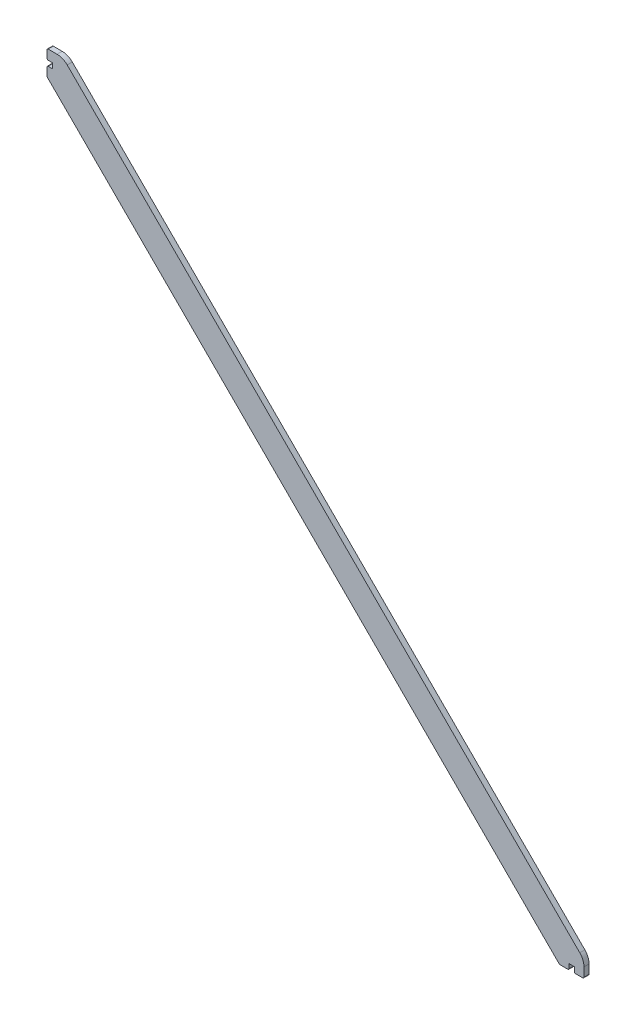
ISO-10303-21;
HEADER;
FILE_DESCRIPTION(('STEP AP214'),'2;1');
FILE_NAME('part.step','',(''),(''),'','','');
FILE_SCHEMA(('AUTOMOTIVE_DESIGN { 1 0 10303 214 1 1 1 1 }'));
ENDSEC;
DATA;
#1=APPLICATION_CONTEXT('core data for automotive mechanical design processes');
#2=APPLICATION_PROTOCOL_DEFINITION('international standard','automotive_design',2000,#1);
#3=PRODUCT_CONTEXT('',#1,'mechanical');
#4=PRODUCT('Part','Part','',(#3));
#5=PRODUCT_RELATED_PRODUCT_CATEGORY('part','',(#4));
#6=PRODUCT_DEFINITION_FORMATION('','',#4);
#7=PRODUCT_DEFINITION_CONTEXT('part definition',#1,'design');
#8=PRODUCT_DEFINITION('design','',#6,#7);
#9=PRODUCT_DEFINITION_SHAPE('','',#8);
#10=(LENGTH_UNIT() NAMED_UNIT(*) SI_UNIT(.MILLI.,.METRE.));
#11=(NAMED_UNIT(*) PLANE_ANGLE_UNIT() SI_UNIT($,.RADIAN.));
#12=(NAMED_UNIT(*) SI_UNIT($,.STERADIAN.) SOLID_ANGLE_UNIT());
#13=UNCERTAINTY_MEASURE_WITH_UNIT(LENGTH_MEASURE(1.E-05),#10,'distance_accuracy_value','');
#14=(GEOMETRIC_REPRESENTATION_CONTEXT(3) GLOBAL_UNCERTAINTY_ASSIGNED_CONTEXT((#13)) GLOBAL_UNIT_ASSIGNED_CONTEXT((#10,
#11,#12)) REPRESENTATION_CONTEXT('',''));
#15=CARTESIAN_POINT('',(0.,0.,0.));
#16=DIRECTION('',(0.,0.,1.));
#17=DIRECTION('',(1.,0.,0.));
#18=AXIS2_PLACEMENT_3D('',#15,#16,#17);
#19=CARTESIAN_POINT('',(-205.,205.,4.));
#20=DIRECTION('',(1.,0.,0.));
#21=DIRECTION('',(0.,0.,-1.));
#22=AXIS2_PLACEMENT_3D('',#19,#20,#21);
#23=PLANE('',#22);
#24=DIRECTION('',(0.,-1.,0.));
#25=VECTOR('',#24,1.);
#26=CARTESIAN_POINT('',(-205.,205.,0.));
#27=LINE('',#26,#25);
#28=CARTESIAN_POINT('',(-205.,205.,0.));
#29=VERTEX_POINT('',#28);
#30=CARTESIAN_POINT('',(-205.,200.9,0.));
#31=VERTEX_POINT('',#30);
#32=EDGE_CURVE('E225',#29,#31,#27,.T.);
#33=ORIENTED_EDGE('',*,*,#32,.T.);
#34=DIRECTION('',(0.,0.,-1.));
#35=VECTOR('',#34,1.);
#36=CARTESIAN_POINT('',(-205.,200.9,4.));
#37=LINE('',#36,#35);
#38=CARTESIAN_POINT('',(-205.,200.9,4.));
#39=VERTEX_POINT('',#38);
#40=EDGE_CURVE('E11',#39,#31,#37,.T.);
#41=ORIENTED_EDGE('',*,*,#40,.F.);
#42=DIRECTION('',(0.,-1.,0.));
#43=VECTOR('',#42,1.);
#44=CARTESIAN_POINT('',(-205.,205.,4.));
#45=LINE('',#44,#43);
#46=CARTESIAN_POINT('',(-205.,205.,4.));
#47=VERTEX_POINT('',#46);
#48=EDGE_CURVE('E273',#47,#39,#45,.T.);
#49=ORIENTED_EDGE('',*,*,#48,.F.);
#50=DIRECTION('',(0.,0.,-1.));
#51=VECTOR('',#50,1.);
#52=CARTESIAN_POINT('',(-205.,205.,4.));
#53=LINE('',#52,#51);
#54=EDGE_CURVE('E221',#47,#29,#53,.T.);
#55=ORIENTED_EDGE('',*,*,#54,.T.);
#56=EDGE_LOOP('',(#33,#41,#49,#55));
#57=FACE_BOUND('',#56,.T.);
#58=ADVANCED_FACE('F33',(#57),#23,.F.);
#59=CARTESIAN_POINT('',(-205.,200.9,4.));
#60=DIRECTION('',(0.,-1.,0.));
#61=DIRECTION('',(1.,0.,0.));
#62=AXIS2_PLACEMENT_3D('',#59,#60,#61);
#63=PLANE('',#62);
#64=DIRECTION('',(-1.,0.,0.));
#65=VECTOR('',#64,1.);
#66=CARTESIAN_POINT('',(-205.,200.9,0.));
#67=LINE('',#66,#65);
#68=CARTESIAN_POINT('',(-208.304951288349,200.9,0.));
#69=VERTEX_POINT('',#68);
#70=EDGE_CURVE('E228',#31,#69,#67,.T.);
#71=ORIENTED_EDGE('',*,*,#70,.T.);
#72=DIRECTION('',(0.,0.,-1.));
#73=VECTOR('',#72,1.);
#74=CARTESIAN_POINT('',(-208.304951288349,200.9,4.));
#75=LINE('',#74,#73);
#76=CARTESIAN_POINT('',(-208.304951288349,200.9,4.));
#77=VERTEX_POINT('',#76);
#78=EDGE_CURVE('E41',#77,#69,#75,.T.);
#79=ORIENTED_EDGE('',*,*,#78,.F.);
#80=DIRECTION('',(-1.,0.,0.));
#81=VECTOR('',#80,1.);
#82=CARTESIAN_POINT('',(-205.,200.9,4.));
#83=LINE('',#82,#81);
#84=EDGE_CURVE('E140',#39,#77,#83,.T.);
#85=ORIENTED_EDGE('',*,*,#84,.F.);
#86=ORIENTED_EDGE('',*,*,#40,.T.);
#87=EDGE_LOOP('',(#71,#79,#85,#86));
#88=FACE_BOUND('',#87,.T.);
#89=ADVANCED_FACE('F410',(#88),#63,.F.);
#90=CARTESIAN_POINT('',(-208.304951288349,199.9,4.));
#91=DIRECTION('',(0.,0.,-1.));
#92=DIRECTION('',(-1.,0.,0.));
#93=AXIS2_PLACEMENT_3D('',#90,#91,#92);
#94=CYLINDRICAL_SURFACE('',#93,1.);
#95=CARTESIAN_POINT('',(-208.304951288349,199.9,0.));
#96=DIRECTION('',(0.,0.,1.));
#97=DIRECTION('',(1.,0.,0.));
#98=AXIS2_PLACEMENT_3D('',#95,#96,#97);
#99=CIRCLE('',#98,1.);
#100=CARTESIAN_POINT('',(-209.304951288349,199.9,0.));
#101=VERTEX_POINT('',#100);
#102=EDGE_CURVE('E230',#69,#101,#99,.T.);
#103=ORIENTED_EDGE('',*,*,#102,.T.);
#104=DIRECTION('',(0.,0.,-1.));
#105=VECTOR('',#104,1.);
#106=CARTESIAN_POINT('',(-209.304951288349,199.9,4.));
#107=LINE('',#106,#105);
#108=CARTESIAN_POINT('',(-209.304951288349,199.9,4.));
#109=VERTEX_POINT('',#108);
#110=EDGE_CURVE('E328',#109,#101,#107,.T.);
#111=ORIENTED_EDGE('',*,*,#110,.F.);
#112=CARTESIAN_POINT('',(-208.304951288349,199.9,4.));
#113=DIRECTION('',(0.,0.,1.));
#114=DIRECTION('',(1.,0.,0.));
#115=AXIS2_PLACEMENT_3D('',#112,#113,#114);
#116=CIRCLE('',#115,1.);
#117=EDGE_CURVE('E336',#77,#109,#116,.T.);
#118=ORIENTED_EDGE('',*,*,#117,.F.);
#119=ORIENTED_EDGE('',*,*,#78,.T.);
#120=EDGE_LOOP('',(#103,#111,#118,#119));
#121=FACE_BOUND('',#120,.T.);
#122=ADVANCED_FACE('F334',(#121),#94,.T.);
#123=CARTESIAN_POINT('',(-209.304951288349,199.9,4.));
#124=DIRECTION('',(1.,0.,0.));
#125=DIRECTION('',(0.,0.,-1.));
#126=AXIS2_PLACEMENT_3D('',#123,#124,#125);
#127=PLANE('',#126);
#128=DIRECTION('',(0.,-1.,0.));
#129=VECTOR('',#128,1.);
#130=CARTESIAN_POINT('',(-209.304951288349,199.9,0.));
#131=LINE('',#130,#129);
#132=CARTESIAN_POINT('',(-209.304951288349,193.809262274024,0.));
#133=VERTEX_POINT('',#132);
#134=EDGE_CURVE('E232',#101,#133,#131,.T.);
#135=ORIENTED_EDGE('',*,*,#134,.T.);
#136=DIRECTION('',(0.,0.,-1.));
#137=VECTOR('',#136,1.);
#138=CARTESIAN_POINT('',(-209.304951288349,193.809262274024,4.));
#139=LINE('',#138,#137);
#140=CARTESIAN_POINT('',(-209.304951288349,193.809262274024,4.));
#141=VERTEX_POINT('',#140);
#142=EDGE_CURVE('E325',#141,#133,#139,.T.);
#143=ORIENTED_EDGE('',*,*,#142,.F.);
#144=DIRECTION('',(0.,-1.,0.));
#145=VECTOR('',#144,1.);
#146=CARTESIAN_POINT('',(-209.304951288349,199.9,4.));
#147=LINE('',#146,#145);
#148=EDGE_CURVE('E353',#109,#141,#147,.T.);
#149=ORIENTED_EDGE('',*,*,#148,.F.);
#150=ORIENTED_EDGE('',*,*,#110,.T.);
#151=EDGE_LOOP('',(#135,#143,#149,#150));
#152=FACE_BOUND('',#151,.T.);
#153=ADVANCED_FACE('F344',(#152),#127,.F.);
#154=CARTESIAN_POINT('',(-208.304951288349,193.809262274024,4.));
#155=DIRECTION('',(0.,0.,-1.));
#156=DIRECTION('',(-1.,0.,0.));
#157=AXIS2_PLACEMENT_3D('',#154,#155,#156);
#158=CYLINDRICAL_SURFACE('',#157,0.999999999999999);
#159=CARTESIAN_POINT('',(-208.304951288349,193.809262274024,0.));
#160=DIRECTION('',(0.,0.,1.));
#161=DIRECTION('',(1.,0.,0.));
#162=AXIS2_PLACEMENT_3D('',#159,#160,#161);
#163=CIRCLE('',#162,0.999999999999999);
#164=CARTESIAN_POINT('',(-209.012058069535,193.102155492838,0.));
#165=VERTEX_POINT('',#164);
#166=EDGE_CURVE('E234',#133,#165,#163,.T.);
#167=ORIENTED_EDGE('',*,*,#166,.T.);
#168=DIRECTION('',(0.,0.,-1.));
#169=VECTOR('',#168,1.);
#170=CARTESIAN_POINT('',(-209.012058069535,193.102155492838,4.));
#171=LINE('',#170,#169);
#172=CARTESIAN_POINT('',(-209.012058069535,193.102155492838,4.));
#173=VERTEX_POINT('',#172);
#174=EDGE_CURVE('E322',#173,#165,#171,.T.);
#175=ORIENTED_EDGE('',*,*,#174,.F.);
#176=CARTESIAN_POINT('',(-208.304951288349,193.809262274024,4.));
#177=DIRECTION('',(0.,0.,1.));
#178=DIRECTION('',(1.,0.,0.));
#179=AXIS2_PLACEMENT_3D('',#176,#177,#178);
#180=CIRCLE('',#179,0.999999999999999);
#181=EDGE_CURVE('E350',#141,#173,#180,.T.);
#182=ORIENTED_EDGE('',*,*,#181,.F.);
#183=ORIENTED_EDGE('',*,*,#142,.T.);
#184=EDGE_LOOP('',(#167,#175,#182,#183));
#185=FACE_BOUND('',#184,.T.);
#186=ADVANCED_FACE('F348',(#185),#158,.T.);
#187=CARTESIAN_POINT('',(193.102155492838,-209.012058069535,4.));
#188=DIRECTION('',(0.707106781186547,0.707106781186547,0.));
#189=DIRECTION('',(-0.707106781186548,0.707106781186548,0.));
#190=AXIS2_PLACEMENT_3D('',#187,#188,#189);
#191=PLANE('',#190);
#192=DIRECTION('',(0.707106781186548,-0.707106781186548,0.));
#193=VECTOR('',#192,1.);
#194=CARTESIAN_POINT('',(193.102155492838,-209.012058069535,0.));
#195=LINE('',#194,#193);
#196=CARTESIAN_POINT('',(193.102155492838,-209.012058069535,0.));
#197=VERTEX_POINT('',#196);
#198=EDGE_CURVE('E237',#165,#197,#195,.T.);
#199=ORIENTED_EDGE('',*,*,#198,.T.);
#200=DIRECTION('',(0.,0.,-1.));
#201=VECTOR('',#200,1.);
#202=CARTESIAN_POINT('',(193.102155492838,-209.012058069535,4.));
#203=LINE('',#202,#201);
#204=CARTESIAN_POINT('',(193.102155492838,-209.012058069535,4.));
#205=VERTEX_POINT('',#204);
#206=EDGE_CURVE('E319',#205,#197,#203,.T.);
#207=ORIENTED_EDGE('',*,*,#206,.F.);
#208=DIRECTION('',(0.707106781186547,-0.707106781186547,0.));
#209=VECTOR('',#208,1.);
#210=CARTESIAN_POINT('',(-209.012058069535,193.102155492838,4.));
#211=LINE('',#210,#209);
#212=EDGE_CURVE('E352',#173,#205,#211,.T.);
#213=ORIENTED_EDGE('',*,*,#212,.F.);
#214=ORIENTED_EDGE('',*,*,#174,.T.);
#215=EDGE_LOOP('',(#199,#207,#213,#214));
#216=FACE_BOUND('',#215,.T.);
#217=ADVANCED_FACE('F423',(#216),#191,.F.);
#218=CARTESIAN_POINT('',(193.809262274024,-208.304951288349,4.));
#219=DIRECTION('',(0.,0.,-1.));
#220=DIRECTION('',(-1.,0.,0.));
#221=AXIS2_PLACEMENT_3D('',#218,#219,#220);
#222=CYLINDRICAL_SURFACE('',#221,0.999999999999971);
#223=CARTESIAN_POINT('',(193.809262274024,-208.304951288349,0.));
#224=DIRECTION('',(0.,0.,1.));
#225=DIRECTION('',(-1.,0.,0.));
#226=AXIS2_PLACEMENT_3D('',#223,#224,#225);
#227=CIRCLE('',#226,0.999999999999971);
#228=CARTESIAN_POINT('',(193.809262274024,-209.304951288349,0.));
#229=VERTEX_POINT('',#228);
#230=EDGE_CURVE('E239',#197,#229,#227,.T.);
#231=ORIENTED_EDGE('',*,*,#230,.T.);
#232=DIRECTION('',(0.,0.,-1.));
#233=VECTOR('',#232,1.);
#234=CARTESIAN_POINT('',(193.809262274024,-209.304951288349,4.));
#235=LINE('',#234,#233);
#236=CARTESIAN_POINT('',(193.809262274024,-209.304951288349,4.));
#237=VERTEX_POINT('',#236);
#238=EDGE_CURVE('E316',#237,#229,#235,.T.);
#239=ORIENTED_EDGE('',*,*,#238,.F.);
#240=CARTESIAN_POINT('',(193.809262274024,-208.304951288349,4.));
#241=DIRECTION('',(0.,0.,1.));
#242=DIRECTION('',(-1.,0.,0.));
#243=AXIS2_PLACEMENT_3D('',#240,#241,#242);
#244=CIRCLE('',#243,0.999999999999971);
#245=EDGE_CURVE('E355',#205,#237,#244,.T.);
#246=ORIENTED_EDGE('',*,*,#245,.F.);
#247=ORIENTED_EDGE('',*,*,#206,.T.);
#248=EDGE_LOOP('',(#231,#239,#246,#247));
#249=FACE_BOUND('',#248,.T.);
#250=ADVANCED_FACE('F426',(#249),#222,.T.);
#251=CARTESIAN_POINT('',(199.9,-209.304951288349,4.));
#252=DIRECTION('',(0.,1.,0.));
#253=DIRECTION('',(0.,0.,1.));
#254=AXIS2_PLACEMENT_3D('',#251,#252,#253);
#255=PLANE('',#254);
#256=DIRECTION('',(1.,0.,0.));
#257=VECTOR('',#256,1.);
#258=CARTESIAN_POINT('',(199.9,-209.304951288349,0.));
#259=LINE('',#258,#257);
#260=CARTESIAN_POINT('',(199.9,-209.304951288349,0.));
#261=VERTEX_POINT('',#260);
#262=EDGE_CURVE('E241',#229,#261,#259,.T.);
#263=ORIENTED_EDGE('',*,*,#262,.T.);
#264=DIRECTION('',(0.,0.,-1.));
#265=VECTOR('',#264,1.);
#266=CARTESIAN_POINT('',(199.9,-209.304951288349,4.));
#267=LINE('',#266,#265);
#268=CARTESIAN_POINT('',(199.9,-209.304951288349,4.));
#269=VERTEX_POINT('',#268);
#270=EDGE_CURVE('E313',#269,#261,#267,.T.);
#271=ORIENTED_EDGE('',*,*,#270,.F.);
#272=DIRECTION('',(1.,0.,0.));
#273=VECTOR('',#272,1.);
#274=CARTESIAN_POINT('',(199.9,-209.304951288349,4.));
#275=LINE('',#274,#273);
#276=EDGE_CURVE('E361',#237,#269,#275,.T.);
#277=ORIENTED_EDGE('',*,*,#276,.F.);
#278=ORIENTED_EDGE('',*,*,#238,.T.);
#279=EDGE_LOOP('',(#263,#271,#277,#278));
#280=FACE_BOUND('',#279,.T.);
#281=ADVANCED_FACE('F430',(#280),#255,.F.);
#282=CARTESIAN_POINT('',(199.9,-208.304951288349,4.));
#283=DIRECTION('',(0.,0.,-1.));
#284=DIRECTION('',(-1.,0.,0.));
#285=AXIS2_PLACEMENT_3D('',#282,#283,#284);
#286=CYLINDRICAL_SURFACE('',#285,1.);
#287=CARTESIAN_POINT('',(199.9,-208.304951288349,0.));
#288=DIRECTION('',(0.,0.,1.));
#289=DIRECTION('',(-1.,0.,0.));
#290=AXIS2_PLACEMENT_3D('',#287,#288,#289);
#291=CIRCLE('',#290,1.);
#292=CARTESIAN_POINT('',(200.9,-208.304951288349,0.));
#293=VERTEX_POINT('',#292);
#294=EDGE_CURVE('E243',#261,#293,#291,.T.);
#295=ORIENTED_EDGE('',*,*,#294,.T.);
#296=DIRECTION('',(0.,0.,-1.));
#297=VECTOR('',#296,1.);
#298=CARTESIAN_POINT('',(200.9,-208.304951288349,4.));
#299=LINE('',#298,#297);
#300=CARTESIAN_POINT('',(200.9,-208.304951288349,4.));
#301=VERTEX_POINT('',#300);
#302=EDGE_CURVE('E310',#301,#293,#299,.T.);
#303=ORIENTED_EDGE('',*,*,#302,.F.);
#304=CARTESIAN_POINT('',(199.9,-208.304951288349,4.));
#305=DIRECTION('',(0.,0.,1.));
#306=DIRECTION('',(-1.,0.,0.));
#307=AXIS2_PLACEMENT_3D('',#304,#305,#306);
#308=CIRCLE('',#307,1.);
#309=EDGE_CURVE('E363',#269,#301,#308,.T.);
#310=ORIENTED_EDGE('',*,*,#309,.F.);
#311=ORIENTED_EDGE('',*,*,#270,.T.);
#312=EDGE_LOOP('',(#295,#303,#310,#311));
#313=FACE_BOUND('',#312,.T.);
#314=ADVANCED_FACE('F434',(#313),#286,.T.);
#315=CARTESIAN_POINT('',(200.9,-205.,4.));
#316=DIRECTION('',(-1.,0.,0.));
#317=DIRECTION('',(0.,0.,1.));
#318=AXIS2_PLACEMENT_3D('',#315,#316,#317);
#319=PLANE('',#318);
#320=DIRECTION('',(0.,1.,0.));
#321=VECTOR('',#320,1.);
#322=CARTESIAN_POINT('',(200.9,-205.,0.));
#323=LINE('',#322,#321);
#324=CARTESIAN_POINT('',(200.9,-205.,0.));
#325=VERTEX_POINT('',#324);
#326=EDGE_CURVE('E245',#293,#325,#323,.T.);
#327=ORIENTED_EDGE('',*,*,#326,.T.);
#328=DIRECTION('',(0.,0.,-1.));
#329=VECTOR('',#328,1.);
#330=CARTESIAN_POINT('',(200.9,-205.,4.));
#331=LINE('',#330,#329);
#332=CARTESIAN_POINT('',(200.9,-205.,4.));
#333=VERTEX_POINT('',#332);
#334=EDGE_CURVE('E307',#333,#325,#331,.T.);
#335=ORIENTED_EDGE('',*,*,#334,.F.);
#336=DIRECTION('',(0.,1.,0.));
#337=VECTOR('',#336,1.);
#338=CARTESIAN_POINT('',(200.9,-205.,4.));
#339=LINE('',#338,#337);
#340=EDGE_CURVE('E365',#301,#333,#339,.T.);
#341=ORIENTED_EDGE('',*,*,#340,.F.);
#342=ORIENTED_EDGE('',*,*,#302,.T.);
#343=EDGE_LOOP('',(#327,#335,#341,#342));
#344=FACE_BOUND('',#343,.T.);
#345=ADVANCED_FACE('F438',(#344),#319,.F.);
#346=CARTESIAN_POINT('',(205.,-205.,4.));
#347=DIRECTION('',(0.,1.,0.));
#348=DIRECTION('',(-1.,0.,0.));
#349=AXIS2_PLACEMENT_3D('',#346,#347,#348);
#350=PLANE('',#349);
#351=DIRECTION('',(1.,0.,0.));
#352=VECTOR('',#351,1.);
#353=CARTESIAN_POINT('',(205.,-205.,0.));
#354=LINE('',#353,#352);
#355=CARTESIAN_POINT('',(205.,-205.,0.));
#356=VERTEX_POINT('',#355);
#357=EDGE_CURVE('E247',#325,#356,#354,.T.);
#358=ORIENTED_EDGE('',*,*,#357,.T.);
#359=DIRECTION('',(0.,0.,-1.));
#360=VECTOR('',#359,1.);
#361=CARTESIAN_POINT('',(205.,-205.,4.));
#362=LINE('',#361,#360);
#363=CARTESIAN_POINT('',(205.,-205.,4.));
#364=VERTEX_POINT('',#363);
#365=EDGE_CURVE('E304',#364,#356,#362,.T.);
#366=ORIENTED_EDGE('',*,*,#365,.F.);
#367=DIRECTION('',(1.,0.,0.));
#368=VECTOR('',#367,1.);
#369=CARTESIAN_POINT('',(205.,-205.,4.));
#370=LINE('',#369,#368);
#371=EDGE_CURVE('E367',#333,#364,#370,.T.);
#372=ORIENTED_EDGE('',*,*,#371,.F.);
#373=ORIENTED_EDGE('',*,*,#334,.T.);
#374=EDGE_LOOP('',(#358,#366,#372,#373));
#375=FACE_BOUND('',#374,.T.);
#376=ADVANCED_FACE('F442',(#375),#350,.F.);
#377=CARTESIAN_POINT('',(205.,-208.304951288349,4.));
#378=DIRECTION('',(1.,0.,0.));
#379=DIRECTION('',(0.,1.,0.));
#380=AXIS2_PLACEMENT_3D('',#377,#378,#379);
#381=PLANE('',#380);
#382=DIRECTION('',(0.,-1.,0.));
#383=VECTOR('',#382,1.);
#384=CARTESIAN_POINT('',(205.,-208.304951288349,0.));
#385=LINE('',#384,#383);
#386=CARTESIAN_POINT('',(205.,-208.304951288349,0.));
#387=VERTEX_POINT('',#386);
#388=EDGE_CURVE('E249',#356,#387,#385,.T.);
#389=ORIENTED_EDGE('',*,*,#388,.T.);
#390=DIRECTION('',(0.,0.,-1.));
#391=VECTOR('',#390,1.);
#392=CARTESIAN_POINT('',(205.,-208.304951288349,4.));
#393=LINE('',#392,#391);
#394=CARTESIAN_POINT('',(205.,-208.304951288349,4.));
#395=VERTEX_POINT('',#394);
#396=EDGE_CURVE('E301',#395,#387,#393,.T.);
#397=ORIENTED_EDGE('',*,*,#396,.F.);
#398=DIRECTION('',(0.,-1.,0.));
#399=VECTOR('',#398,1.);
#400=CARTESIAN_POINT('',(205.,-208.304951288349,4.));
#401=LINE('',#400,#399);
#402=EDGE_CURVE('E369',#364,#395,#401,.T.);
#403=ORIENTED_EDGE('',*,*,#402,.F.);
#404=ORIENTED_EDGE('',*,*,#365,.T.);
#405=EDGE_LOOP('',(#389,#397,#403,#404));
#406=FACE_BOUND('',#405,.T.);
#407=ADVANCED_FACE('F446',(#406),#381,.F.);
#408=CARTESIAN_POINT('',(206.,-208.304951288349,4.));
#409=DIRECTION('',(0.,0.,-1.));
#410=DIRECTION('',(-1.,0.,0.));
#411=AXIS2_PLACEMENT_3D('',#408,#409,#410);
#412=CYLINDRICAL_SURFACE('',#411,0.999999999999987);
#413=CARTESIAN_POINT('',(206.,-208.304951288349,0.));
#414=DIRECTION('',(0.,0.,1.));
#415=DIRECTION('',(-1.,0.,0.));
#416=AXIS2_PLACEMENT_3D('',#413,#414,#415);
#417=CIRCLE('',#416,0.999999999999987);
#418=CARTESIAN_POINT('',(206.,-209.304951288349,0.));
#419=VERTEX_POINT('',#418);
#420=EDGE_CURVE('E251',#387,#419,#417,.T.);
#421=ORIENTED_EDGE('',*,*,#420,.T.);
#422=DIRECTION('',(0.,0.,-1.));
#423=VECTOR('',#422,1.);
#424=CARTESIAN_POINT('',(206.,-209.304951288349,4.));
#425=LINE('',#424,#423);
#426=CARTESIAN_POINT('',(206.,-209.304951288349,4.));
#427=VERTEX_POINT('',#426);
#428=EDGE_CURVE('E298',#427,#419,#425,.T.);
#429=ORIENTED_EDGE('',*,*,#428,.F.);
#430=CARTESIAN_POINT('',(206.,-208.304951288349,4.));
#431=DIRECTION('',(0.,0.,1.));
#432=DIRECTION('',(-1.,0.,0.));
#433=AXIS2_PLACEMENT_3D('',#430,#431,#432);
#434=CIRCLE('',#433,0.999999999999987);
#435=EDGE_CURVE('E371',#395,#427,#434,.T.);
#436=ORIENTED_EDGE('',*,*,#435,.F.);
#437=ORIENTED_EDGE('',*,*,#396,.T.);
#438=EDGE_LOOP('',(#421,#429,#436,#437));
#439=FACE_BOUND('',#438,.T.);
#440=ADVANCED_FACE('F450',(#439),#412,.T.);
#441=CARTESIAN_POINT('',(211.6,-209.304951288349,4.));
#442=DIRECTION('',(0.,1.,0.));
#443=DIRECTION('',(-1.,0.,0.));
#444=AXIS2_PLACEMENT_3D('',#441,#442,#443);
#445=PLANE('',#444);
#446=DIRECTION('',(1.,0.,0.));
#447=VECTOR('',#446,1.);
#448=CARTESIAN_POINT('',(211.6,-209.304951288349,0.));
#449=LINE('',#448,#447);
#450=CARTESIAN_POINT('',(211.6,-209.304951288349,0.));
#451=VERTEX_POINT('',#450);
#452=EDGE_CURVE('E253',#419,#451,#449,.T.);
#453=ORIENTED_EDGE('',*,*,#452,.T.);
#454=DIRECTION('',(0.,0.,-1.));
#455=VECTOR('',#454,1.);
#456=CARTESIAN_POINT('',(211.6,-209.304951288349,4.));
#457=LINE('',#456,#455);
#458=CARTESIAN_POINT('',(211.6,-209.304951288349,4.));
#459=VERTEX_POINT('',#458);
#460=EDGE_CURVE('E295',#459,#451,#457,.T.);
#461=ORIENTED_EDGE('',*,*,#460,.F.);
#462=DIRECTION('',(1.,0.,0.));
#463=VECTOR('',#462,1.);
#464=CARTESIAN_POINT('',(211.6,-209.304951288349,4.));
#465=LINE('',#464,#463);
#466=EDGE_CURVE('E373',#427,#459,#465,.T.);
#467=ORIENTED_EDGE('',*,*,#466,.F.);
#468=ORIENTED_EDGE('',*,*,#428,.T.);
#469=EDGE_LOOP('',(#453,#461,#467,#468));
#470=FACE_BOUND('',#469,.T.);
#471=ADVANCED_FACE('F454',(#470),#445,.F.);
#472=CARTESIAN_POINT('',(211.6,-208.304951288349,4.));
#473=DIRECTION('',(0.,0.,-1.));
#474=DIRECTION('',(-1.,0.,0.));
#475=AXIS2_PLACEMENT_3D('',#472,#473,#474);
#476=CYLINDRICAL_SURFACE('',#475,1.00000000000006);
#477=CARTESIAN_POINT('',(211.6,-208.304951288349,0.));
#478=DIRECTION('',(0.,0.,1.));
#479=DIRECTION('',(-1.,0.,0.));
#480=AXIS2_PLACEMENT_3D('',#477,#478,#479);
#481=CIRCLE('',#480,1.00000000000006);
#482=CARTESIAN_POINT('',(212.6,-208.304951288349,0.));
#483=VERTEX_POINT('',#482);
#484=EDGE_CURVE('E255',#451,#483,#481,.T.);
#485=ORIENTED_EDGE('',*,*,#484,.T.);
#486=DIRECTION('',(0.,0.,-1.));
#487=VECTOR('',#486,1.);
#488=CARTESIAN_POINT('',(212.6,-208.304951288349,4.));
#489=LINE('',#488,#487);
#490=CARTESIAN_POINT('',(212.6,-208.304951288349,4.));
#491=VERTEX_POINT('',#490);
#492=EDGE_CURVE('E292',#491,#483,#489,.T.);
#493=ORIENTED_EDGE('',*,*,#492,.F.);
#494=CARTESIAN_POINT('',(211.6,-208.304951288349,4.));
#495=DIRECTION('',(0.,0.,1.));
#496=DIRECTION('',(-1.,0.,0.));
#497=AXIS2_PLACEMENT_3D('',#494,#495,#496);
#498=CIRCLE('',#497,1.00000000000006);
#499=EDGE_CURVE('E375',#459,#491,#498,.T.);
#500=ORIENTED_EDGE('',*,*,#499,.F.);
#501=ORIENTED_EDGE('',*,*,#460,.T.);
#502=EDGE_LOOP('',(#485,#493,#500,#501));
#503=FACE_BOUND('',#502,.T.);
#504=ADVANCED_FACE('F458',(#503),#476,.T.);
#505=CARTESIAN_POINT('',(212.6,-201.35,4.));
#506=DIRECTION('',(-1.,0.,0.));
#507=DIRECTION('',(0.,-1.,0.));
#508=AXIS2_PLACEMENT_3D('',#505,#506,#507);
#509=PLANE('',#508);
#510=DIRECTION('',(0.,1.,0.));
#511=VECTOR('',#510,1.);
#512=CARTESIAN_POINT('',(212.6,-201.35,0.));
#513=LINE('',#512,#511);
#514=CARTESIAN_POINT('',(212.6,-201.35,0.));
#515=VERTEX_POINT('',#514);
#516=EDGE_CURVE('E257',#483,#515,#513,.T.);
#517=ORIENTED_EDGE('',*,*,#516,.T.);
#518=DIRECTION('',(0.,0.,-1.));
#519=VECTOR('',#518,1.);
#520=CARTESIAN_POINT('',(212.6,-201.35,4.));
#521=LINE('',#520,#519);
#522=CARTESIAN_POINT('',(212.6,-201.35,4.));
#523=VERTEX_POINT('',#522);
#524=EDGE_CURVE('E289',#523,#515,#521,.T.);
#525=ORIENTED_EDGE('',*,*,#524,.F.);
#526=DIRECTION('',(0.,1.,0.));
#527=VECTOR('',#526,1.);
#528=CARTESIAN_POINT('',(212.6,-201.35,4.));
#529=LINE('',#528,#527);
#530=EDGE_CURVE('E377',#491,#523,#529,.T.);
#531=ORIENTED_EDGE('',*,*,#530,.F.);
#532=ORIENTED_EDGE('',*,*,#492,.T.);
#533=EDGE_LOOP('',(#517,#525,#531,#532));
#534=FACE_BOUND('',#533,.T.);
#535=ADVANCED_FACE('F462',(#534),#509,.F.);
#536=CARTESIAN_POINT('',(201.35,-201.35,4.));
#537=DIRECTION('',(0.,0.,-1.));
#538=DIRECTION('',(-1.,0.,0.));
#539=AXIS2_PLACEMENT_3D('',#536,#537,#538);
#540=CYLINDRICAL_SURFACE('',#539,11.25);
#541=CARTESIAN_POINT('',(201.35,-201.35,0.));
#542=DIRECTION('',(0.,0.,1.));
#543=DIRECTION('',(-1.,0.,0.));
#544=AXIS2_PLACEMENT_3D('',#541,#542,#543);
#545=CIRCLE('',#544,11.25);
#546=CARTESIAN_POINT('',(209.304951288349,-193.395048711651,0.));
#547=VERTEX_POINT('',#546);
#548=EDGE_CURVE('E259',#515,#547,#545,.T.);
#549=ORIENTED_EDGE('',*,*,#548,.T.);
#550=DIRECTION('',(0.,0.,-1.));
#551=VECTOR('',#550,1.);
#552=CARTESIAN_POINT('',(209.304951288349,-193.395048711651,4.));
#553=LINE('',#552,#551);
#554=CARTESIAN_POINT('',(209.304951288349,-193.395048711651,4.));
#555=VERTEX_POINT('',#554);
#556=EDGE_CURVE('E286',#555,#547,#553,.T.);
#557=ORIENTED_EDGE('',*,*,#556,.F.);
#558=CARTESIAN_POINT('',(201.35,-201.35,4.));
#559=DIRECTION('',(0.,0.,1.));
#560=DIRECTION('',(-1.,0.,0.));
#561=AXIS2_PLACEMENT_3D('',#558,#559,#560);
#562=CIRCLE('',#561,11.25);
#563=EDGE_CURVE('E379',#523,#555,#562,.T.);
#564=ORIENTED_EDGE('',*,*,#563,.F.);
#565=ORIENTED_EDGE('',*,*,#524,.T.);
#566=EDGE_LOOP('',(#549,#557,#564,#565));
#567=FACE_BOUND('',#566,.T.);
#568=ADVANCED_FACE('F466',(#567),#540,.T.);
#569=CARTESIAN_POINT('',(-193.395048711651,209.304951288349,4.));
#570=DIRECTION('',(-0.707106781186547,-0.707106781186547,0.));
#571=DIRECTION('',(0.707106781186548,-0.707106781186548,0.));
#572=AXIS2_PLACEMENT_3D('',#569,#570,#571);
#573=PLANE('',#572);
#574=DIRECTION('',(-0.707106781186548,0.707106781186548,0.));
#575=VECTOR('',#574,1.);
#576=CARTESIAN_POINT('',(-193.395048711651,209.304951288349,0.));
#577=LINE('',#576,#575);
#578=CARTESIAN_POINT('',(-193.395048711651,209.304951288349,0.));
#579=VERTEX_POINT('',#578);
#580=EDGE_CURVE('E262',#547,#579,#577,.T.);
#581=ORIENTED_EDGE('',*,*,#580,.T.);
#582=DIRECTION('',(0.,0.,-1.));
#583=VECTOR('',#582,1.);
#584=CARTESIAN_POINT('',(-193.395048711651,209.304951288349,4.));
#585=LINE('',#584,#583);
#586=CARTESIAN_POINT('',(-193.395048711651,209.304951288349,4.));
#587=VERTEX_POINT('',#586);
#588=EDGE_CURVE('E283',#587,#579,#585,.T.);
#589=ORIENTED_EDGE('',*,*,#588,.F.);
#590=DIRECTION('',(-0.707106781186548,0.707106781186548,0.));
#591=VECTOR('',#590,1.);
#592=CARTESIAN_POINT('',(209.304951288349,-193.395048711651,4.));
#593=LINE('',#592,#591);
#594=EDGE_CURVE('E381',#555,#587,#593,.T.);
#595=ORIENTED_EDGE('',*,*,#594,.F.);
#596=ORIENTED_EDGE('',*,*,#556,.T.);
#597=EDGE_LOOP('',(#581,#589,#595,#596));
#598=FACE_BOUND('',#597,.T.);
#599=ADVANCED_FACE('F470',(#598),#573,.F.);
#600=CARTESIAN_POINT('',(-201.35,201.35,4.));
#601=DIRECTION('',(0.,0.,-1.));
#602=DIRECTION('',(-1.,0.,0.));
#603=AXIS2_PLACEMENT_3D('',#600,#601,#602);
#604=CYLINDRICAL_SURFACE('',#603,11.25);
#605=CARTESIAN_POINT('',(-201.35,201.35,0.));
#606=DIRECTION('',(0.,0.,1.));
#607=DIRECTION('',(1.,0.,0.));
#608=AXIS2_PLACEMENT_3D('',#605,#606,#607);
#609=CIRCLE('',#608,11.25);
#610=CARTESIAN_POINT('',(-201.35,212.6,0.));
#611=VERTEX_POINT('',#610);
#612=EDGE_CURVE('E264',#579,#611,#609,.T.);
#613=ORIENTED_EDGE('',*,*,#612,.T.);
#614=DIRECTION('',(0.,0.,-1.));
#615=VECTOR('',#614,1.);
#616=CARTESIAN_POINT('',(-201.35,212.6,4.));
#617=LINE('',#616,#615);
#618=CARTESIAN_POINT('',(-201.35,212.6,4.));
#619=VERTEX_POINT('',#618);
#620=EDGE_CURVE('E280',#619,#611,#617,.T.);
#621=ORIENTED_EDGE('',*,*,#620,.F.);
#622=CARTESIAN_POINT('',(-201.35,201.35,4.));
#623=DIRECTION('',(0.,0.,1.));
#624=DIRECTION('',(1.,0.,0.));
#625=AXIS2_PLACEMENT_3D('',#622,#623,#624);
#626=CIRCLE('',#625,11.25);
#627=EDGE_CURVE('E383',#587,#619,#626,.T.);
#628=ORIENTED_EDGE('',*,*,#627,.F.);
#629=ORIENTED_EDGE('',*,*,#588,.T.);
#630=EDGE_LOOP('',(#613,#621,#628,#629));
#631=FACE_BOUND('',#630,.T.);
#632=ADVANCED_FACE('F474',(#631),#604,.T.);
#633=CARTESIAN_POINT('',(-201.35,212.6,4.));
#634=DIRECTION('',(0.,-1.,0.));
#635=DIRECTION('',(1.,0.,0.));
#636=AXIS2_PLACEMENT_3D('',#633,#634,#635);
#637=PLANE('',#636);
#638=DIRECTION('',(-1.,0.,0.));
#639=VECTOR('',#638,1.);
#640=CARTESIAN_POINT('',(-201.35,212.6,0.));
#641=LINE('',#640,#639);
#642=CARTESIAN_POINT('',(-208.304951288349,212.6,0.));
#643=VERTEX_POINT('',#642);
#644=EDGE_CURVE('E266',#611,#643,#641,.T.);
#645=ORIENTED_EDGE('',*,*,#644,.T.);
#646=DIRECTION('',(0.,0.,-1.));
#647=VECTOR('',#646,1.);
#648=CARTESIAN_POINT('',(-208.304951288349,212.6,4.));
#649=LINE('',#648,#647);
#650=CARTESIAN_POINT('',(-208.304951288349,212.6,4.));
#651=VERTEX_POINT('',#650);
#652=EDGE_CURVE('E277',#651,#643,#649,.T.);
#653=ORIENTED_EDGE('',*,*,#652,.F.);
#654=DIRECTION('',(-1.,0.,0.));
#655=VECTOR('',#654,1.);
#656=CARTESIAN_POINT('',(-201.35,212.6,4.));
#657=LINE('',#656,#655);
#658=EDGE_CURVE('E385',#619,#651,#657,.T.);
#659=ORIENTED_EDGE('',*,*,#658,.F.);
#660=ORIENTED_EDGE('',*,*,#620,.T.);
#661=EDGE_LOOP('',(#645,#653,#659,#660));
#662=FACE_BOUND('',#661,.T.);
#663=ADVANCED_FACE('F391',(#662),#637,.F.);
#664=CARTESIAN_POINT('',(-208.304951288349,211.6,4.));
#665=DIRECTION('',(0.,0.,-1.));
#666=DIRECTION('',(-1.,0.,0.));
#667=AXIS2_PLACEMENT_3D('',#664,#665,#666);
#668=CYLINDRICAL_SURFACE('',#667,1.);
#669=CARTESIAN_POINT('',(-208.304951288349,211.6,0.));
#670=DIRECTION('',(0.,0.,1.));
#671=DIRECTION('',(1.,0.,0.));
#672=AXIS2_PLACEMENT_3D('',#669,#670,#671);
#673=CIRCLE('',#672,1.);
#674=CARTESIAN_POINT('',(-209.304951288349,211.6,0.));
#675=VERTEX_POINT('',#674);
#676=EDGE_CURVE('E268',#643,#675,#673,.T.);
#677=ORIENTED_EDGE('',*,*,#676,.T.);
#678=DIRECTION('',(0.,0.,-1.));
#679=VECTOR('',#678,1.);
#680=CARTESIAN_POINT('',(-209.304951288349,211.6,4.));
#681=LINE('',#680,#679);
#682=CARTESIAN_POINT('',(-209.304951288349,211.6,4.));
#683=VERTEX_POINT('',#682);
#684=EDGE_CURVE('E216',#683,#675,#681,.T.);
#685=ORIENTED_EDGE('',*,*,#684,.F.);
#686=CARTESIAN_POINT('',(-208.304951288349,211.6,4.));
#687=DIRECTION('',(0.,0.,1.));
#688=DIRECTION('',(1.,0.,0.));
#689=AXIS2_PLACEMENT_3D('',#686,#687,#688);
#690=CIRCLE('',#689,1.);
#691=EDGE_CURVE('E207',#651,#683,#690,.T.);
#692=ORIENTED_EDGE('',*,*,#691,.F.);
#693=ORIENTED_EDGE('',*,*,#652,.T.);
#694=EDGE_LOOP('',(#677,#685,#692,#693));
#695=FACE_BOUND('',#694,.T.);
#696=ADVANCED_FACE('F395',(#695),#668,.T.);
#697=CARTESIAN_POINT('',(-209.304951288349,211.6,4.));
#698=DIRECTION('',(1.,0.,0.));
#699=DIRECTION('',(0.,0.,-1.));
#700=AXIS2_PLACEMENT_3D('',#697,#698,#699);
#701=PLANE('',#700);
#702=DIRECTION('',(0.,-1.,0.));
#703=VECTOR('',#702,1.);
#704=CARTESIAN_POINT('',(-209.304951288349,211.6,0.));
#705=LINE('',#704,#703);
#706=CARTESIAN_POINT('',(-209.304951288349,206.,0.));
#707=VERTEX_POINT('',#706);
#708=EDGE_CURVE('E215',#675,#707,#705,.T.);
#709=ORIENTED_EDGE('',*,*,#708,.T.);
#710=DIRECTION('',(0.,0.,-1.));
#711=VECTOR('',#710,1.);
#712=CARTESIAN_POINT('',(-209.304951288349,206.,4.));
#713=LINE('',#712,#711);
#714=CARTESIAN_POINT('',(-209.304951288349,206.,4.));
#715=VERTEX_POINT('',#714);
#716=EDGE_CURVE('E212',#715,#707,#713,.T.);
#717=ORIENTED_EDGE('',*,*,#716,.F.);
#718=DIRECTION('',(0.,-1.,0.));
#719=VECTOR('',#718,1.);
#720=CARTESIAN_POINT('',(-209.304951288349,211.6,4.));
#721=LINE('',#720,#719);
#722=EDGE_CURVE('E201',#683,#715,#721,.T.);
#723=ORIENTED_EDGE('',*,*,#722,.F.);
#724=ORIENTED_EDGE('',*,*,#684,.T.);
#725=EDGE_LOOP('',(#709,#717,#723,#724));
#726=FACE_BOUND('',#725,.T.);
#727=ADVANCED_FACE('F213',(#726),#701,.F.);
#728=CARTESIAN_POINT('',(-208.304951288349,206.,4.));
#729=DIRECTION('',(0.,0.,-1.));
#730=DIRECTION('',(-1.,0.,0.));
#731=AXIS2_PLACEMENT_3D('',#728,#729,#730);
#732=CYLINDRICAL_SURFACE('',#731,1.);
#733=CARTESIAN_POINT('',(-208.304951288349,206.,0.));
#734=DIRECTION('',(0.,0.,1.));
#735=DIRECTION('',(1.,0.,0.));
#736=AXIS2_PLACEMENT_3D('',#733,#734,#735);
#737=CIRCLE('',#736,1.);
#738=CARTESIAN_POINT('',(-208.304951288349,205.,0.));
#739=VERTEX_POINT('',#738);
#740=EDGE_CURVE('E126',#707,#739,#737,.T.);
#741=ORIENTED_EDGE('',*,*,#740,.T.);
#742=DIRECTION('',(0.,0.,-1.));
#743=VECTOR('',#742,1.);
#744=CARTESIAN_POINT('',(-208.304951288349,205.,4.));
#745=LINE('',#744,#743);
#746=CARTESIAN_POINT('',(-208.304951288349,205.,4.));
#747=VERTEX_POINT('',#746);
#748=EDGE_CURVE('E217',#747,#739,#745,.T.);
#749=ORIENTED_EDGE('',*,*,#748,.F.);
#750=CARTESIAN_POINT('',(-208.304951288349,206.,4.));
#751=DIRECTION('',(0.,0.,1.));
#752=DIRECTION('',(1.,0.,0.));
#753=AXIS2_PLACEMENT_3D('',#750,#751,#752);
#754=CIRCLE('',#753,1.);
#755=EDGE_CURVE('E205',#715,#747,#754,.T.);
#756=ORIENTED_EDGE('',*,*,#755,.F.);
#757=ORIENTED_EDGE('',*,*,#716,.T.);
#758=EDGE_LOOP('',(#741,#749,#756,#757));
#759=FACE_BOUND('',#758,.T.);
#760=ADVANCED_FACE('F219',(#759),#732,.T.);
#761=CARTESIAN_POINT('',(-208.304951288349,205.,4.));
#762=DIRECTION('',(0.,1.,0.));
#763=DIRECTION('',(0.,0.,1.));
#764=AXIS2_PLACEMENT_3D('',#761,#762,#763);
#765=PLANE('',#764);
#766=DIRECTION('',(1.,0.,0.));
#767=VECTOR('',#766,1.);
#768=CARTESIAN_POINT('',(-208.304951288349,205.,0.));
#769=LINE('',#768,#767);
#770=EDGE_CURVE('E132',#739,#29,#769,.T.);
#771=ORIENTED_EDGE('',*,*,#770,.T.);
#772=ORIENTED_EDGE('',*,*,#54,.F.);
#773=DIRECTION('',(1.,0.,0.));
#774=VECTOR('',#773,1.);
#775=CARTESIAN_POINT('',(-208.304951288349,205.,4.));
#776=LINE('',#775,#774);
#777=EDGE_CURVE('E49',#747,#47,#776,.T.);
#778=ORIENTED_EDGE('',*,*,#777,.F.);
#779=ORIENTED_EDGE('',*,*,#748,.T.);
#780=EDGE_LOOP('',(#771,#772,#778,#779));
#781=FACE_BOUND('',#780,.T.);
#782=ADVANCED_FACE('F399',(#781),#765,.F.);
#783=CARTESIAN_POINT('',(-208.304951288349,199.9,4.));
#784=DIRECTION('',(0.,0.,1.));
#785=DIRECTION('',(1.,0.,0.));
#786=AXIS2_PLACEMENT_3D('',#783,#784,#785);
#787=PLANE('',#786);
#788=ORIENTED_EDGE('',*,*,#48,.T.);
#789=ORIENTED_EDGE('',*,*,#84,.T.);
#790=ORIENTED_EDGE('',*,*,#117,.T.);
#791=ORIENTED_EDGE('',*,*,#148,.T.);
#792=ORIENTED_EDGE('',*,*,#181,.T.);
#793=ORIENTED_EDGE('',*,*,#212,.T.);
#794=ORIENTED_EDGE('',*,*,#245,.T.);
#795=ORIENTED_EDGE('',*,*,#276,.T.);
#796=ORIENTED_EDGE('',*,*,#309,.T.);
#797=ORIENTED_EDGE('',*,*,#340,.T.);
#798=ORIENTED_EDGE('',*,*,#371,.T.);
#799=ORIENTED_EDGE('',*,*,#402,.T.);
#800=ORIENTED_EDGE('',*,*,#435,.T.);
#801=ORIENTED_EDGE('',*,*,#466,.T.);
#802=ORIENTED_EDGE('',*,*,#499,.T.);
#803=ORIENTED_EDGE('',*,*,#530,.T.);
#804=ORIENTED_EDGE('',*,*,#563,.T.);
#805=ORIENTED_EDGE('',*,*,#594,.T.);
#806=ORIENTED_EDGE('',*,*,#627,.T.);
#807=ORIENTED_EDGE('',*,*,#658,.T.);
#808=ORIENTED_EDGE('',*,*,#691,.T.);
#809=ORIENTED_EDGE('',*,*,#722,.T.);
#810=ORIENTED_EDGE('',*,*,#755,.T.);
#811=ORIENTED_EDGE('',*,*,#777,.T.);
#812=EDGE_LOOP('',(#788,#789,#790,#791,#792,#793,#794,#795,#796,#797,#798,#799,#800,#801,#802,
#803,#804,#805,#806,#807,#808,#809,#810,#811));
#813=FACE_BOUND('',#812,.T.);
#814=ADVANCED_FACE('F203',(#813),#787,.T.);
#815=CARTESIAN_POINT('',(-208.304951288349,199.9,0.));
#816=DIRECTION('',(0.,0.,1.));
#817=DIRECTION('',(1.,0.,0.));
#818=AXIS2_PLACEMENT_3D('',#815,#816,#817);
#819=PLANE('',#818);
#820=ORIENTED_EDGE('',*,*,#32,.F.);
#821=ORIENTED_EDGE('',*,*,#770,.F.);
#822=ORIENTED_EDGE('',*,*,#740,.F.);
#823=ORIENTED_EDGE('',*,*,#708,.F.);
#824=ORIENTED_EDGE('',*,*,#676,.F.);
#825=ORIENTED_EDGE('',*,*,#644,.F.);
#826=ORIENTED_EDGE('',*,*,#612,.F.);
#827=ORIENTED_EDGE('',*,*,#580,.F.);
#828=ORIENTED_EDGE('',*,*,#548,.F.);
#829=ORIENTED_EDGE('',*,*,#516,.F.);
#830=ORIENTED_EDGE('',*,*,#484,.F.);
#831=ORIENTED_EDGE('',*,*,#452,.F.);
#832=ORIENTED_EDGE('',*,*,#420,.F.);
#833=ORIENTED_EDGE('',*,*,#388,.F.);
#834=ORIENTED_EDGE('',*,*,#357,.F.);
#835=ORIENTED_EDGE('',*,*,#326,.F.);
#836=ORIENTED_EDGE('',*,*,#294,.F.);
#837=ORIENTED_EDGE('',*,*,#262,.F.);
#838=ORIENTED_EDGE('',*,*,#230,.F.);
#839=ORIENTED_EDGE('',*,*,#198,.F.);
#840=ORIENTED_EDGE('',*,*,#166,.F.);
#841=ORIENTED_EDGE('',*,*,#134,.F.);
#842=ORIENTED_EDGE('',*,*,#102,.F.);
#843=ORIENTED_EDGE('',*,*,#70,.F.);
#844=EDGE_LOOP('',(#820,#821,#822,#823,#824,#825,#826,#827,#828,#829,#830,#831,#832,#833,#834,
#835,#836,#837,#838,#839,#840,#841,#842,#843));
#845=FACE_BOUND('',#844,.T.);
#846=ADVANCED_FACE('F340',(#845),#819,.F.);
#847=CLOSED_SHELL('',(#58,#89,#122,#153,#186,#217,#250,#281,#314,#345,#376,#407,#440,#471,#504,
#535,#568,#599,#632,#663,#696,#727,#760,#782,#814,#846));
#848=MANIFOLD_SOLID_BREP('B2',#847);
#849=ADVANCED_BREP_SHAPE_REPRESENTATION('',(#18,#848),#14);
#850=SHAPE_DEFINITION_REPRESENTATION(#9,#849);
ENDSEC;
END-ISO-10303-21;
